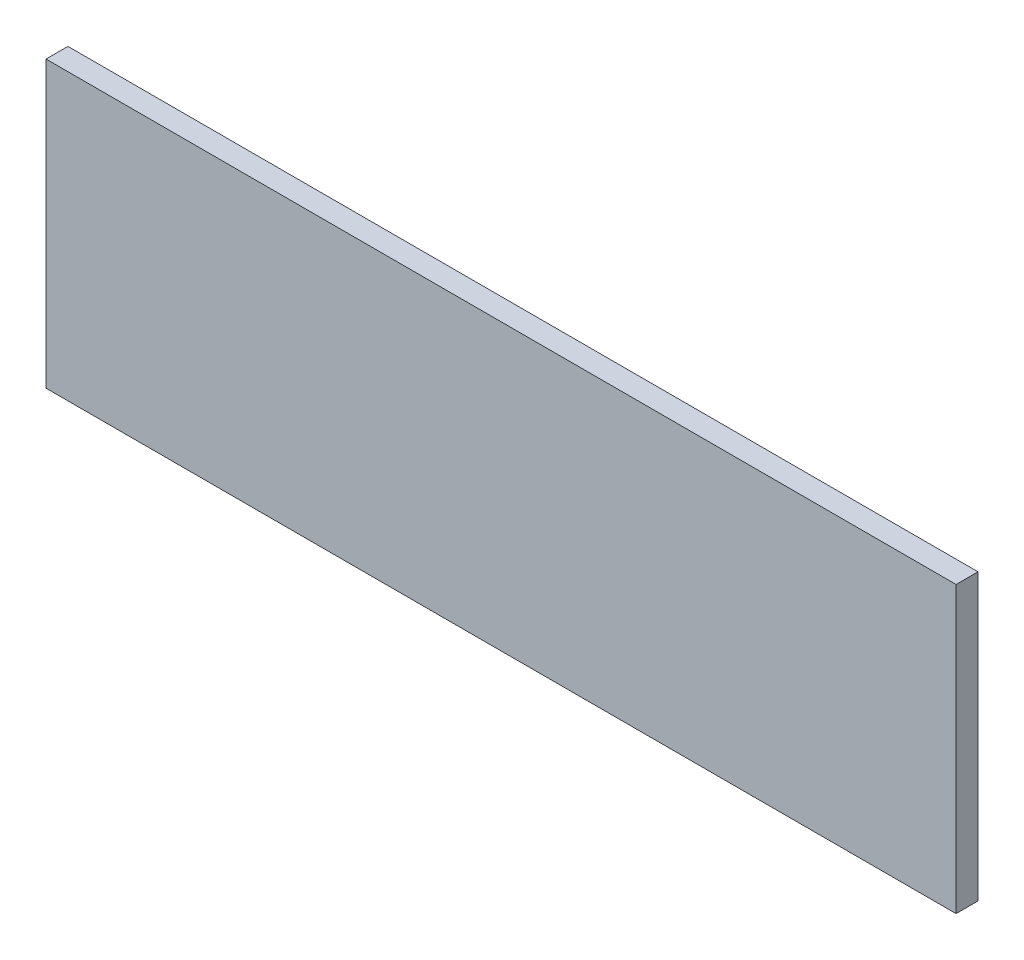
ISO-10303-21;
HEADER;
FILE_DESCRIPTION(('STEP AP214'),'2;1');
FILE_NAME('part.step','',(''),(''),'','','');
FILE_SCHEMA(('AUTOMOTIVE_DESIGN { 1 0 10303 214 1 1 1 1 }'));
ENDSEC;
DATA;
#1=APPLICATION_CONTEXT('core data for automotive mechanical design processes');
#2=APPLICATION_PROTOCOL_DEFINITION('international standard','automotive_design',2000,#1);
#3=PRODUCT_CONTEXT('',#1,'mechanical');
#4=PRODUCT('Part','Part','',(#3));
#5=PRODUCT_RELATED_PRODUCT_CATEGORY('part','',(#4));
#6=PRODUCT_DEFINITION_FORMATION('','',#4);
#7=PRODUCT_DEFINITION_CONTEXT('part definition',#1,'design');
#8=PRODUCT_DEFINITION('design','',#6,#7);
#9=PRODUCT_DEFINITION_SHAPE('','',#8);
#10=(LENGTH_UNIT() NAMED_UNIT(*) SI_UNIT(.MILLI.,.METRE.));
#11=(NAMED_UNIT(*) PLANE_ANGLE_UNIT() SI_UNIT($,.RADIAN.));
#12=(NAMED_UNIT(*) SI_UNIT($,.STERADIAN.) SOLID_ANGLE_UNIT());
#13=UNCERTAINTY_MEASURE_WITH_UNIT(LENGTH_MEASURE(1.E-05),#10,'distance_accuracy_value','');
#14=(GEOMETRIC_REPRESENTATION_CONTEXT(3) GLOBAL_UNCERTAINTY_ASSIGNED_CONTEXT((#13)) GLOBAL_UNIT_ASSIGNED_CONTEXT((#10,
#11,#12)) REPRESENTATION_CONTEXT('',''));
#15=CARTESIAN_POINT('',(0.,0.,0.));
#16=DIRECTION('',(0.,0.,1.));
#17=DIRECTION('',(1.,0.,0.));
#18=AXIS2_PLACEMENT_3D('',#15,#16,#17);
#19=CARTESIAN_POINT('',(41.5,13.,2.));
#20=DIRECTION('',(-1.,0.,0.));
#21=DIRECTION('',(0.,-1.,0.));
#22=AXIS2_PLACEMENT_3D('',#19,#20,#21);
#23=PLANE('',#22);
#24=DIRECTION('',(0.,1.,0.));
#25=VECTOR('',#24,1.);
#26=CARTESIAN_POINT('',(41.5,13.,0.));
#27=LINE('',#26,#25);
#28=CARTESIAN_POINT('',(41.5,-13.,0.));
#29=VERTEX_POINT('',#28);
#30=CARTESIAN_POINT('',(41.5,13.,0.));
#31=VERTEX_POINT('',#30);
#32=EDGE_CURVE('E104',#29,#31,#27,.T.);
#33=ORIENTED_EDGE('',*,*,#32,.T.);
#34=DIRECTION('',(0.,0.,-1.));
#35=VECTOR('',#34,1.);
#36=CARTESIAN_POINT('',(41.5,13.,2.));
#37=LINE('',#36,#35);
#38=CARTESIAN_POINT('',(41.5,13.,2.));
#39=VERTEX_POINT('',#38);
#40=EDGE_CURVE('E11',#39,#31,#37,.T.);
#41=ORIENTED_EDGE('',*,*,#40,.F.);
#42=DIRECTION('',(0.,1.,0.));
#43=VECTOR('',#42,1.);
#44=CARTESIAN_POINT('',(41.5,13.,2.));
#45=LINE('',#44,#43);
#46=CARTESIAN_POINT('',(41.5,-13.,2.));
#47=VERTEX_POINT('',#46);
#48=EDGE_CURVE('E92',#47,#39,#45,.T.);
#49=ORIENTED_EDGE('',*,*,#48,.F.);
#50=DIRECTION('',(0.,0.,-1.));
#51=VECTOR('',#50,1.);
#52=CARTESIAN_POINT('',(41.5,-13.,2.));
#53=LINE('',#52,#51);
#54=EDGE_CURVE('E100',#47,#29,#53,.T.);
#55=ORIENTED_EDGE('',*,*,#54,.T.);
#56=EDGE_LOOP('',(#33,#41,#49,#55));
#57=FACE_BOUND('',#56,.T.);
#58=ADVANCED_FACE('F41',(#57),#23,.F.);
#59=CARTESIAN_POINT('',(-41.5,13.,2.));
#60=DIRECTION('',(0.,-1.,0.));
#61=DIRECTION('',(0.,0.,-1.));
#62=AXIS2_PLACEMENT_3D('',#59,#60,#61);
#63=PLANE('',#62);
#64=DIRECTION('',(-1.,0.,0.));
#65=VECTOR('',#64,1.);
#66=CARTESIAN_POINT('',(-41.5,13.,0.));
#67=LINE('',#66,#65);
#68=CARTESIAN_POINT('',(-41.5,13.,0.));
#69=VERTEX_POINT('',#68);
#70=EDGE_CURVE('E96',#31,#69,#67,.T.);
#71=ORIENTED_EDGE('',*,*,#70,.T.);
#72=DIRECTION('',(0.,0.,-1.));
#73=VECTOR('',#72,1.);
#74=CARTESIAN_POINT('',(-41.5,13.,2.));
#75=LINE('',#74,#73);
#76=CARTESIAN_POINT('',(-41.5,13.,2.));
#77=VERTEX_POINT('',#76);
#78=EDGE_CURVE('E49',#77,#69,#75,.T.);
#79=ORIENTED_EDGE('',*,*,#78,.F.);
#80=DIRECTION('',(-1.,0.,0.));
#81=VECTOR('',#80,1.);
#82=CARTESIAN_POINT('',(-41.5,13.,2.));
#83=LINE('',#82,#81);
#84=EDGE_CURVE('E87',#39,#77,#83,.T.);
#85=ORIENTED_EDGE('',*,*,#84,.F.);
#86=ORIENTED_EDGE('',*,*,#40,.T.);
#87=EDGE_LOOP('',(#71,#79,#85,#86));
#88=FACE_BOUND('',#87,.T.);
#89=ADVANCED_FACE('F95',(#88),#63,.F.);
#90=CARTESIAN_POINT('',(-41.5,13.,2.));
#91=DIRECTION('',(1.,0.,0.));
#92=DIRECTION('',(0.,0.,-1.));
#93=AXIS2_PLACEMENT_3D('',#90,#91,#92);
#94=PLANE('',#93);
#95=DIRECTION('',(0.,-1.,0.));
#96=VECTOR('',#95,1.);
#97=CARTESIAN_POINT('',(-41.5,13.,0.));
#98=LINE('',#97,#96);
#99=CARTESIAN_POINT('',(-41.5,-13.,0.));
#100=VERTEX_POINT('',#99);
#101=EDGE_CURVE('E74',#69,#100,#98,.T.);
#102=ORIENTED_EDGE('',*,*,#101,.T.);
#103=DIRECTION('',(0.,0.,-1.));
#104=VECTOR('',#103,1.);
#105=CARTESIAN_POINT('',(-41.5,-13.,2.));
#106=LINE('',#105,#104);
#107=CARTESIAN_POINT('',(-41.5,-13.,2.));
#108=VERTEX_POINT('',#107);
#109=EDGE_CURVE('E97',#108,#100,#106,.T.);
#110=ORIENTED_EDGE('',*,*,#109,.F.);
#111=DIRECTION('',(0.,-1.,0.));
#112=VECTOR('',#111,1.);
#113=CARTESIAN_POINT('',(-41.5,13.,2.));
#114=LINE('',#113,#112);
#115=EDGE_CURVE('E90',#77,#108,#114,.T.);
#116=ORIENTED_EDGE('',*,*,#115,.F.);
#117=ORIENTED_EDGE('',*,*,#78,.T.);
#118=EDGE_LOOP('',(#102,#110,#116,#117));
#119=FACE_BOUND('',#118,.T.);
#120=ADVANCED_FACE('F98',(#119),#94,.F.);
#121=CARTESIAN_POINT('',(-41.5,-13.,2.));
#122=DIRECTION('',(0.,1.,0.));
#123=DIRECTION('',(0.,0.,1.));
#124=AXIS2_PLACEMENT_3D('',#121,#122,#123);
#125=PLANE('',#124);
#126=DIRECTION('',(1.,0.,0.));
#127=VECTOR('',#126,1.);
#128=CARTESIAN_POINT('',(-41.5,-13.,0.));
#129=LINE('',#128,#127);
#130=EDGE_CURVE('E80',#100,#29,#129,.T.);
#131=ORIENTED_EDGE('',*,*,#130,.T.);
#132=ORIENTED_EDGE('',*,*,#54,.F.);
#133=DIRECTION('',(1.,0.,0.));
#134=VECTOR('',#133,1.);
#135=CARTESIAN_POINT('',(-41.5,-13.,2.));
#136=LINE('',#135,#134);
#137=EDGE_CURVE('E57',#108,#47,#136,.T.);
#138=ORIENTED_EDGE('',*,*,#137,.F.);
#139=ORIENTED_EDGE('',*,*,#109,.T.);
#140=EDGE_LOOP('',(#131,#132,#138,#139));
#141=FACE_BOUND('',#140,.T.);
#142=ADVANCED_FACE('F111',(#141),#125,.F.);
#143=CARTESIAN_POINT('',(0.,0.,2.));
#144=DIRECTION('',(0.,0.,1.));
#145=DIRECTION('',(1.,0.,0.));
#146=AXIS2_PLACEMENT_3D('',#143,#144,#145);
#147=PLANE('',#146);
#148=ORIENTED_EDGE('',*,*,#48,.T.);
#149=ORIENTED_EDGE('',*,*,#84,.T.);
#150=ORIENTED_EDGE('',*,*,#115,.T.);
#151=ORIENTED_EDGE('',*,*,#137,.T.);
#152=EDGE_LOOP('',(#148,#149,#150,#151));
#153=FACE_BOUND('',#152,.T.);
#154=ADVANCED_FACE('F88',(#153),#147,.T.);
#155=CARTESIAN_POINT('',(0.,0.,0.));
#156=DIRECTION('',(0.,0.,1.));
#157=DIRECTION('',(1.,0.,0.));
#158=AXIS2_PLACEMENT_3D('',#155,#156,#157);
#159=PLANE('',#158);
#160=ORIENTED_EDGE('',*,*,#32,.F.);
#161=ORIENTED_EDGE('',*,*,#130,.F.);
#162=ORIENTED_EDGE('',*,*,#101,.F.);
#163=ORIENTED_EDGE('',*,*,#70,.F.);
#164=EDGE_LOOP('',(#160,#161,#162,#163));
#165=FACE_BOUND('',#164,.T.);
#166=ADVANCED_FACE('F114',(#165),#159,.F.);
#167=CLOSED_SHELL('',(#58,#89,#120,#142,#154,#166));
#168=MANIFOLD_SOLID_BREP('B2',#167);
#169=ADVANCED_BREP_SHAPE_REPRESENTATION('',(#18,#168),#14);
#170=SHAPE_DEFINITION_REPRESENTATION(#9,#169);
ENDSEC;
END-ISO-10303-21;
